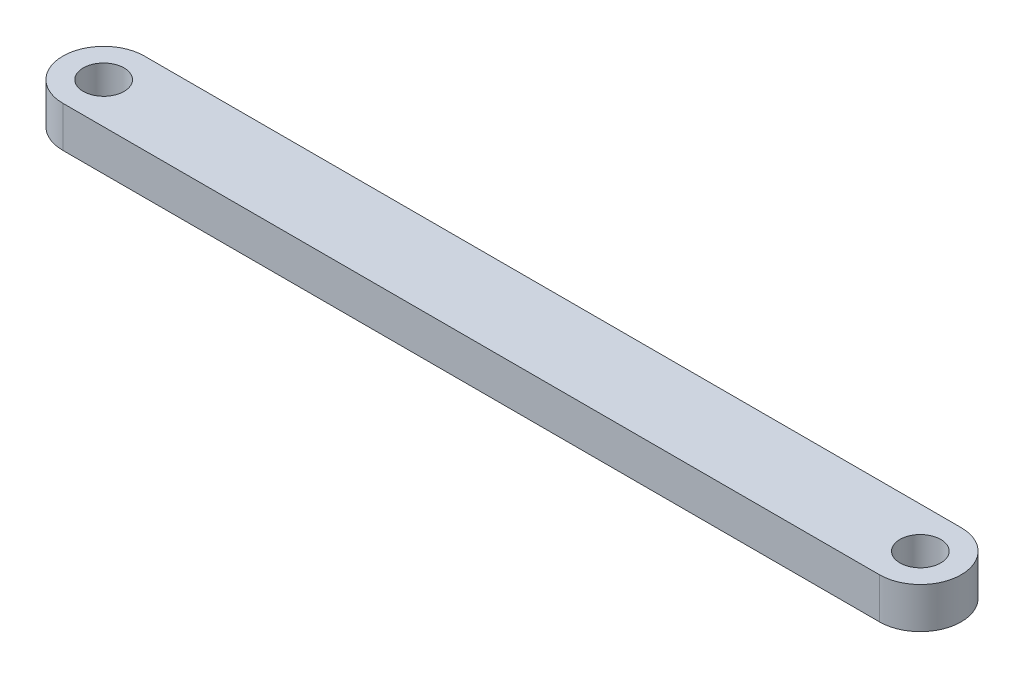
ISO-10303-21;
HEADER;
FILE_DESCRIPTION(('STEP AP214'),'2;1');
FILE_NAME('part.step','',(''),(''),'','','');
FILE_SCHEMA(('AUTOMOTIVE_DESIGN { 1 0 10303 214 1 1 1 1 }'));
ENDSEC;
DATA;
#1=APPLICATION_CONTEXT('core data for automotive mechanical design processes');
#2=APPLICATION_PROTOCOL_DEFINITION('international standard','automotive_design',2000,#1);
#3=PRODUCT_CONTEXT('',#1,'mechanical');
#4=PRODUCT('Part','Part','',(#3));
#5=PRODUCT_RELATED_PRODUCT_CATEGORY('part','',(#4));
#6=PRODUCT_DEFINITION_FORMATION('','',#4);
#7=PRODUCT_DEFINITION_CONTEXT('part definition',#1,'design');
#8=PRODUCT_DEFINITION('design','',#6,#7);
#9=PRODUCT_DEFINITION_SHAPE('','',#8);
#10=(LENGTH_UNIT() NAMED_UNIT(*) SI_UNIT(.MILLI.,.METRE.));
#11=(NAMED_UNIT(*) PLANE_ANGLE_UNIT() SI_UNIT($,.RADIAN.));
#12=(NAMED_UNIT(*) SI_UNIT($,.STERADIAN.) SOLID_ANGLE_UNIT());
#13=UNCERTAINTY_MEASURE_WITH_UNIT(LENGTH_MEASURE(1.E-05),#10,'distance_accuracy_value','');
#14=(GEOMETRIC_REPRESENTATION_CONTEXT(3) GLOBAL_UNCERTAINTY_ASSIGNED_CONTEXT((#13)) GLOBAL_UNIT_ASSIGNED_CONTEXT((#10,
#11,#12)) REPRESENTATION_CONTEXT('',''));
#15=CARTESIAN_POINT('',(0.,0.,0.));
#16=DIRECTION('',(0.,0.,1.));
#17=DIRECTION('',(1.,0.,0.));
#18=AXIS2_PLACEMENT_3D('',#15,#16,#17);
#19=CARTESIAN_POINT('',(0.,5.,0.));
#20=DIRECTION('',(0.,-1.,0.));
#21=DIRECTION('',(0.,0.,-1.));
#22=AXIS2_PLACEMENT_3D('',#19,#20,#21);
#23=CYLINDRICAL_SURFACE('',#22,5.);
#24=CARTESIAN_POINT('',(0.,0.,0.));
#25=DIRECTION('',(0.,1.,0.));
#26=DIRECTION('',(0.,0.,1.));
#27=AXIS2_PLACEMENT_3D('',#24,#25,#26);
#28=CIRCLE('',#27,5.);
#29=CARTESIAN_POINT('',(0.,0.,-5.));
#30=VERTEX_POINT('',#29);
#31=CARTESIAN_POINT('',(0.,0.,5.));
#32=VERTEX_POINT('',#31);
#33=EDGE_CURVE('E95',#30,#32,#28,.T.);
#34=ORIENTED_EDGE('',*,*,#33,.T.);
#35=DIRECTION('',(0.,-1.,0.));
#36=VECTOR('',#35,1.);
#37=CARTESIAN_POINT('',(0.,5.,5.));
#38=LINE('',#37,#36);
#39=CARTESIAN_POINT('',(0.,5.,5.));
#40=VERTEX_POINT('',#39);
#41=EDGE_CURVE('E11',#40,#32,#38,.T.);
#42=ORIENTED_EDGE('',*,*,#41,.F.);
#43=CARTESIAN_POINT('',(0.,5.,0.));
#44=DIRECTION('',(0.,1.,0.));
#45=DIRECTION('',(0.,0.,1.));
#46=AXIS2_PLACEMENT_3D('',#43,#44,#45);
#47=CIRCLE('',#46,5.);
#48=CARTESIAN_POINT('',(0.,5.,-5.));
#49=VERTEX_POINT('',#48);
#50=EDGE_CURVE('E83',#49,#40,#47,.T.);
#51=ORIENTED_EDGE('',*,*,#50,.F.);
#52=DIRECTION('',(0.,-1.,0.));
#53=VECTOR('',#52,1.);
#54=CARTESIAN_POINT('',(0.,5.,-5.));
#55=LINE('',#54,#53);
#56=EDGE_CURVE('E91',#49,#30,#55,.T.);
#57=ORIENTED_EDGE('',*,*,#56,.T.);
#58=EDGE_LOOP('',(#34,#42,#51,#57));
#59=FACE_BOUND('',#58,.T.);
#60=ADVANCED_FACE('F32',(#59),#23,.T.);
#61=CARTESIAN_POINT('',(0.,5.,5.));
#62=DIRECTION('',(0.,0.,-1.));
#63=DIRECTION('',(-1.,0.,0.));
#64=AXIS2_PLACEMENT_3D('',#61,#62,#63);
#65=PLANE('',#64);
#66=DIRECTION('',(1.,0.,0.));
#67=VECTOR('',#66,1.);
#68=CARTESIAN_POINT('',(0.,0.,5.));
#69=LINE('',#68,#67);
#70=CARTESIAN_POINT('',(100.,0.,5.));
#71=VERTEX_POINT('',#70);
#72=EDGE_CURVE('E87',#32,#71,#69,.T.);
#73=ORIENTED_EDGE('',*,*,#72,.T.);
#74=DIRECTION('',(0.,-1.,0.));
#75=VECTOR('',#74,1.);
#76=CARTESIAN_POINT('',(100.,5.,5.));
#77=LINE('',#76,#75);
#78=CARTESIAN_POINT('',(100.,5.,5.));
#79=VERTEX_POINT('',#78);
#80=EDGE_CURVE('E40',#79,#71,#77,.T.);
#81=ORIENTED_EDGE('',*,*,#80,.F.);
#82=DIRECTION('',(1.,0.,0.));
#83=VECTOR('',#82,1.);
#84=CARTESIAN_POINT('',(0.,5.,5.));
#85=LINE('',#84,#83);
#86=EDGE_CURVE('E78',#40,#79,#85,.T.);
#87=ORIENTED_EDGE('',*,*,#86,.F.);
#88=ORIENTED_EDGE('',*,*,#41,.T.);
#89=EDGE_LOOP('',(#73,#81,#87,#88));
#90=FACE_BOUND('',#89,.T.);
#91=ADVANCED_FACE('F86',(#90),#65,.F.);
#92=CARTESIAN_POINT('',(100.,5.,0.));
#93=DIRECTION('',(0.,-1.,0.));
#94=DIRECTION('',(0.,0.,-1.));
#95=AXIS2_PLACEMENT_3D('',#92,#93,#94);
#96=CYLINDRICAL_SURFACE('',#95,5.);
#97=CARTESIAN_POINT('',(100.,0.,0.));
#98=DIRECTION('',(0.,1.,0.));
#99=DIRECTION('',(0.,0.,1.));
#100=AXIS2_PLACEMENT_3D('',#97,#98,#99);
#101=CIRCLE('',#100,5.);
#102=CARTESIAN_POINT('',(100.,0.,-5.));
#103=VERTEX_POINT('',#102);
#104=EDGE_CURVE('E65',#71,#103,#101,.T.);
#105=ORIENTED_EDGE('',*,*,#104,.T.);
#106=DIRECTION('',(0.,-1.,0.));
#107=VECTOR('',#106,1.);
#108=CARTESIAN_POINT('',(100.,5.,-5.));
#109=LINE('',#108,#107);
#110=CARTESIAN_POINT('',(100.,5.,-5.));
#111=VERTEX_POINT('',#110);
#112=EDGE_CURVE('E88',#111,#103,#109,.T.);
#113=ORIENTED_EDGE('',*,*,#112,.F.);
#114=CARTESIAN_POINT('',(100.,5.,0.));
#115=DIRECTION('',(0.,1.,0.));
#116=DIRECTION('',(0.,0.,1.));
#117=AXIS2_PLACEMENT_3D('',#114,#115,#116);
#118=CIRCLE('',#117,5.);
#119=EDGE_CURVE('E81',#79,#111,#118,.T.);
#120=ORIENTED_EDGE('',*,*,#119,.F.);
#121=ORIENTED_EDGE('',*,*,#80,.T.);
#122=EDGE_LOOP('',(#105,#113,#120,#121));
#123=FACE_BOUND('',#122,.T.);
#124=ADVANCED_FACE('F89',(#123),#96,.T.);
#125=CARTESIAN_POINT('',(0.,5.,-5.));
#126=DIRECTION('',(0.,0.,1.));
#127=DIRECTION('',(1.,0.,0.));
#128=AXIS2_PLACEMENT_3D('',#125,#126,#127);
#129=PLANE('',#128);
#130=DIRECTION('',(-1.,0.,0.));
#131=VECTOR('',#130,1.);
#132=CARTESIAN_POINT('',(0.,0.,-5.));
#133=LINE('',#132,#131);
#134=EDGE_CURVE('E71',#103,#30,#133,.T.);
#135=ORIENTED_EDGE('',*,*,#134,.T.);
#136=ORIENTED_EDGE('',*,*,#56,.F.);
#137=DIRECTION('',(-1.,0.,0.));
#138=VECTOR('',#137,1.);
#139=CARTESIAN_POINT('',(0.,5.,-5.));
#140=LINE('',#139,#138);
#141=EDGE_CURVE('E48',#111,#49,#140,.T.);
#142=ORIENTED_EDGE('',*,*,#141,.F.);
#143=ORIENTED_EDGE('',*,*,#112,.T.);
#144=EDGE_LOOP('',(#135,#136,#142,#143));
#145=FACE_BOUND('',#144,.T.);
#146=ADVANCED_FACE('F103',(#145),#129,.F.);
#147=CARTESIAN_POINT('',(0.,5.,0.));
#148=DIRECTION('',(0.,1.,0.));
#149=DIRECTION('',(0.,0.,1.));
#150=AXIS2_PLACEMENT_3D('',#147,#148,#149);
#151=PLANE('',#150);
#152=CARTESIAN_POINT('',(0.,5.,0.));
#153=DIRECTION('',(0.,1.,0.));
#154=DIRECTION('',(0.,0.,1.));
#155=AXIS2_PLACEMENT_3D('',#152,#153,#154);
#156=CIRCLE('',#155,2.5);
#157=CARTESIAN_POINT('',(0.,5.,2.5));
#158=VERTEX_POINT('',#157);
#159=EDGE_CURVE('E115',#158,#158,#156,.T.);
#160=ORIENTED_EDGE('',*,*,#159,.F.);
#161=EDGE_LOOP('',(#160));
#162=FACE_BOUND('',#161,.T.);
#163=CARTESIAN_POINT('',(100.,5.,0.));
#164=DIRECTION('',(0.,1.,0.));
#165=DIRECTION('',(0.,0.,1.));
#166=AXIS2_PLACEMENT_3D('',#163,#164,#165);
#167=CIRCLE('',#166,2.5);
#168=CARTESIAN_POINT('',(100.,5.,2.5));
#169=VERTEX_POINT('',#168);
#170=EDGE_CURVE('E112',#169,#169,#167,.T.);
#171=ORIENTED_EDGE('',*,*,#170,.F.);
#172=EDGE_LOOP('',(#171));
#173=FACE_BOUND('',#172,.T.);
#174=ORIENTED_EDGE('',*,*,#50,.T.);
#175=ORIENTED_EDGE('',*,*,#86,.T.);
#176=ORIENTED_EDGE('',*,*,#119,.T.);
#177=ORIENTED_EDGE('',*,*,#141,.T.);
#178=EDGE_LOOP('',(#174,#175,#176,#177));
#179=FACE_BOUND('',#178,.T.);
#180=ADVANCED_FACE('F79',(#162,#173,#179),#151,.T.);
#181=CARTESIAN_POINT('',(0.,0.,0.));
#182=DIRECTION('',(0.,1.,0.));
#183=DIRECTION('',(0.,0.,1.));
#184=AXIS2_PLACEMENT_3D('',#181,#182,#183);
#185=PLANE('',#184);
#186=CARTESIAN_POINT('',(0.,0.,0.));
#187=DIRECTION('',(0.,1.,0.));
#188=DIRECTION('',(0.,0.,1.));
#189=AXIS2_PLACEMENT_3D('',#186,#187,#188);
#190=CIRCLE('',#189,2.5);
#191=CARTESIAN_POINT('',(0.,0.,2.5));
#192=VERTEX_POINT('',#191);
#193=EDGE_CURVE('E98',#192,#192,#190,.T.);
#194=ORIENTED_EDGE('',*,*,#193,.T.);
#195=EDGE_LOOP('',(#194));
#196=FACE_BOUND('',#195,.T.);
#197=CARTESIAN_POINT('',(100.,0.,0.));
#198=DIRECTION('',(0.,1.,0.));
#199=DIRECTION('',(0.,0.,1.));
#200=AXIS2_PLACEMENT_3D('',#197,#198,#199);
#201=CIRCLE('',#200,2.5);
#202=CARTESIAN_POINT('',(100.,0.,2.5));
#203=VERTEX_POINT('',#202);
#204=EDGE_CURVE('E109',#203,#203,#201,.T.);
#205=ORIENTED_EDGE('',*,*,#204,.T.);
#206=EDGE_LOOP('',(#205));
#207=FACE_BOUND('',#206,.T.);
#208=ORIENTED_EDGE('',*,*,#33,.F.);
#209=ORIENTED_EDGE('',*,*,#134,.F.);
#210=ORIENTED_EDGE('',*,*,#104,.F.);
#211=ORIENTED_EDGE('',*,*,#72,.F.);
#212=EDGE_LOOP('',(#208,#209,#210,#211));
#213=FACE_BOUND('',#212,.T.);
#214=ADVANCED_FACE('F106',(#196,#207,#213),#185,.F.);
#215=CARTESIAN_POINT('',(100.,0.,0.));
#216=DIRECTION('',(0.,1.,0.));
#217=DIRECTION('',(0.,0.,1.));
#218=AXIS2_PLACEMENT_3D('',#215,#216,#217);
#219=CYLINDRICAL_SURFACE('',#218,2.5);
#220=ORIENTED_EDGE('',*,*,#204,.F.);
#221=EDGE_LOOP('',(#220));
#222=FACE_BOUND('',#221,.T.);
#223=ORIENTED_EDGE('',*,*,#170,.T.);
#224=EDGE_LOOP('',(#223));
#225=FACE_BOUND('',#224,.T.);
#226=ADVANCED_FACE('F126',(#222,#225),#219,.F.);
#227=CARTESIAN_POINT('',(0.,0.,0.));
#228=DIRECTION('',(0.,1.,0.));
#229=DIRECTION('',(0.,0.,1.));
#230=AXIS2_PLACEMENT_3D('',#227,#228,#229);
#231=CYLINDRICAL_SURFACE('',#230,2.5);
#232=ORIENTED_EDGE('',*,*,#193,.F.);
#233=EDGE_LOOP('',(#232));
#234=FACE_BOUND('',#233,.T.);
#235=ORIENTED_EDGE('',*,*,#159,.T.);
#236=EDGE_LOOP('',(#235));
#237=FACE_BOUND('',#236,.T.);
#238=ADVANCED_FACE('F123',(#234,#237),#231,.F.);
#239=CLOSED_SHELL('',(#60,#91,#124,#146,#180,#214,#226,#238));
#240=MANIFOLD_SOLID_BREP('B2',#239);
#241=ADVANCED_BREP_SHAPE_REPRESENTATION('',(#18,#240),#14);
#242=SHAPE_DEFINITION_REPRESENTATION(#9,#241);
ENDSEC;
END-ISO-10303-21;
